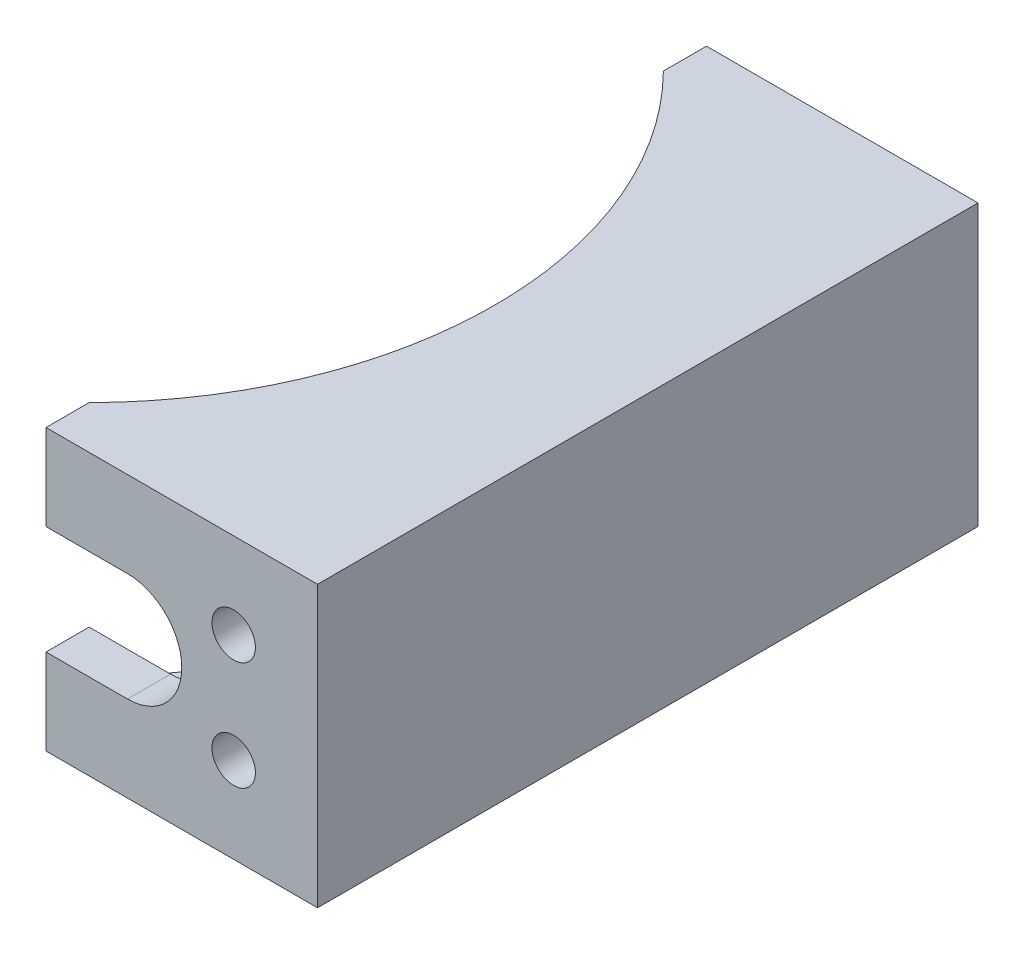
ISO-10303-21;
HEADER;
FILE_DESCRIPTION(('STEP AP214'),'2;1');
FILE_NAME('part.step','',(''),(''),'','','');
FILE_SCHEMA(('AUTOMOTIVE_DESIGN { 1 0 10303 214 1 1 1 1 }'));
ENDSEC;
DATA;
#1=APPLICATION_CONTEXT('core data for automotive mechanical design processes');
#2=APPLICATION_PROTOCOL_DEFINITION('international standard','automotive_design',2000,#1);
#3=PRODUCT_CONTEXT('',#1,'mechanical');
#4=PRODUCT('Part','Part','',(#3));
#5=PRODUCT_RELATED_PRODUCT_CATEGORY('part','',(#4));
#6=PRODUCT_DEFINITION_FORMATION('','',#4);
#7=PRODUCT_DEFINITION_CONTEXT('part definition',#1,'design');
#8=PRODUCT_DEFINITION('design','',#6,#7);
#9=PRODUCT_DEFINITION_SHAPE('','',#8);
#10=(LENGTH_UNIT() NAMED_UNIT(*) SI_UNIT(.MILLI.,.METRE.));
#11=(NAMED_UNIT(*) PLANE_ANGLE_UNIT() SI_UNIT($,.RADIAN.));
#12=(NAMED_UNIT(*) SI_UNIT($,.STERADIAN.) SOLID_ANGLE_UNIT());
#13=UNCERTAINTY_MEASURE_WITH_UNIT(LENGTH_MEASURE(1.E-05),#10,'distance_accuracy_value','');
#14=(GEOMETRIC_REPRESENTATION_CONTEXT(3) GLOBAL_UNCERTAINTY_ASSIGNED_CONTEXT((#13)) GLOBAL_UNIT_ASSIGNED_CONTEXT((#10,
#11,#12)) REPRESENTATION_CONTEXT('',''));
#15=CARTESIAN_POINT('',(0.,0.,0.));
#16=DIRECTION('',(0.,0.,1.));
#17=DIRECTION('',(1.,0.,0.));
#18=AXIS2_PLACEMENT_3D('',#15,#16,#17);
#19=CARTESIAN_POINT('',(-21.276219119007,3.175,21.15));
#20=DIRECTION('',(0.,-1.,0.));
#21=DIRECTION('',(0.,0.,-1.));
#22=AXIS2_PLACEMENT_3D('',#19,#20,#21);
#23=CYLINDRICAL_SURFACE('',#22,30.);
#24=CARTESIAN_POINT('',(-21.276219119007,0.,21.15));
#25=DIRECTION('',(0.,-1.,0.));
#26=DIRECTION('',(0.,0.,1.));
#27=AXIS2_PLACEMENT_3D('',#24,#25,#26);
#28=CIRCLE('',#27,30.);
#29=CARTESIAN_POINT('',(0.,0.,0.));
#30=VERTEX_POINT('',#29);
#31=CARTESIAN_POINT('',(0.,0.,42.3));
#32=VERTEX_POINT('',#31);
#33=EDGE_CURVE('E308',#30,#32,#28,.T.);
#34=ORIENTED_EDGE('',*,*,#33,.T.);
#35=DIRECTION('',(0.,-1.,0.));
#36=VECTOR('',#35,1.);
#37=CARTESIAN_POINT('',(0.,3.175,42.3));
#38=LINE('',#37,#36);
#39=CARTESIAN_POINT('',(0.,3.175,42.3));
#40=VERTEX_POINT('',#39);
#41=EDGE_CURVE('E11',#40,#32,#38,.T.);
#42=ORIENTED_EDGE('',*,*,#41,.F.);
#43=CARTESIAN_POINT('',(-21.276219119007,3.175,21.15));
#44=DIRECTION('',(0.,-1.,0.));
#45=DIRECTION('',(0.,0.,1.));
#46=AXIS2_PLACEMENT_3D('',#43,#44,#45);
#47=CIRCLE('',#46,30.);
#48=CARTESIAN_POINT('',(0.,3.175,0.));
#49=VERTEX_POINT('',#48);
#50=EDGE_CURVE('E309',#49,#40,#47,.T.);
#51=ORIENTED_EDGE('',*,*,#50,.F.);
#52=DIRECTION('',(0.,-1.,0.));
#53=VECTOR('',#52,1.);
#54=CARTESIAN_POINT('',(0.,3.175,0.));
#55=LINE('',#54,#53);
#56=EDGE_CURVE('E40',#49,#30,#55,.T.);
#57=ORIENTED_EDGE('',*,*,#56,.T.);
#58=EDGE_LOOP('',(#34,#42,#51,#57));
#59=FACE_BOUND('',#58,.T.);
#60=ADVANCED_FACE('F33',(#59),#23,.F.);
#61=CARTESIAN_POINT('',(20.,3.175,0.));
#62=DIRECTION('',(-1.,0.,0.));
#63=DIRECTION('',(0.,0.,1.));
#64=AXIS2_PLACEMENT_3D('',#61,#62,#63);
#65=PLANE('',#64);
#66=DIRECTION('',(0.,0.,-1.));
#67=VECTOR('',#66,1.);
#68=CARTESIAN_POINT('',(20.,0.,0.));
#69=LINE('',#68,#67);
#70=CARTESIAN_POINT('',(20.,0.,45.475));
#71=VERTEX_POINT('',#70);
#72=CARTESIAN_POINT('',(20.,0.,-3.175));
#73=VERTEX_POINT('',#72);
#74=EDGE_CURVE('E312',#71,#73,#69,.T.);
#75=ORIENTED_EDGE('',*,*,#74,.T.);
#76=DIRECTION('',(0.,-1.,0.));
#77=VECTOR('',#76,1.);
#78=CARTESIAN_POINT('',(20.,0.,-3.175));
#79=LINE('',#78,#77);
#80=CARTESIAN_POINT('',(20.,20.64,-3.175));
#81=VERTEX_POINT('',#80);
#82=EDGE_CURVE('E164',#81,#73,#79,.T.);
#83=ORIENTED_EDGE('',*,*,#82,.F.);
#84=DIRECTION('',(0.,0.,-1.));
#85=VECTOR('',#84,1.);
#86=CARTESIAN_POINT('',(20.,20.64,0.));
#87=LINE('',#86,#85);
#88=CARTESIAN_POINT('',(20.,20.64,45.475));
#89=VERTEX_POINT('',#88);
#90=EDGE_CURVE('E158',#89,#81,#87,.T.);
#91=ORIENTED_EDGE('',*,*,#90,.F.);
#92=DIRECTION('',(0.,-1.,0.));
#93=VECTOR('',#92,1.);
#94=CARTESIAN_POINT('',(20.,0.,45.475));
#95=LINE('',#94,#93);
#96=EDGE_CURVE('E161',#89,#71,#95,.T.);
#97=ORIENTED_EDGE('',*,*,#96,.T.);
#98=EDGE_LOOP('',(#75,#83,#91,#97));
#99=FACE_BOUND('',#98,.T.);
#100=ADVANCED_FACE('F160',(#99),#65,.F.);
#101=CARTESIAN_POINT('',(-21.276219119007,3.175,21.15));
#102=DIRECTION('',(0.,1.,0.));
#103=DIRECTION('',(0.,0.,1.));
#104=AXIS2_PLACEMENT_3D('',#101,#102,#103);
#105=PLANE('',#104);
#106=DIRECTION('',(0.,0.,1.));
#107=VECTOR('',#106,1.);
#108=CARTESIAN_POINT('',(16.825,3.175,0.));
#109=LINE('',#108,#107);
#110=CARTESIAN_POINT('',(16.825,3.175,0.));
#111=VERTEX_POINT('',#110);
#112=CARTESIAN_POINT('',(16.825,3.175,42.3));
#113=VERTEX_POINT('',#112);
#114=EDGE_CURVE('E47',#111,#113,#109,.T.);
#115=ORIENTED_EDGE('',*,*,#114,.F.);
#116=DIRECTION('',(-1.,0.,0.));
#117=VECTOR('',#116,1.);
#118=CARTESIAN_POINT('',(0.,3.175,0.));
#119=LINE('',#118,#117);
#120=EDGE_CURVE('E53',#111,#49,#119,.T.);
#121=ORIENTED_EDGE('',*,*,#120,.T.);
#122=ORIENTED_EDGE('',*,*,#50,.T.);
#123=DIRECTION('',(1.,0.,0.));
#124=VECTOR('',#123,1.);
#125=CARTESIAN_POINT('',(20.,3.175,42.3));
#126=LINE('',#125,#124);
#127=EDGE_CURVE('E311',#40,#113,#126,.T.);
#128=ORIENTED_EDGE('',*,*,#127,.T.);
#129=EDGE_LOOP('',(#115,#121,#122,#128));
#130=FACE_BOUND('',#129,.T.);
#131=ADVANCED_FACE('F383',(#130),#105,.T.);
#132=CARTESIAN_POINT('',(-21.276219119007,0.,21.15));
#133=DIRECTION('',(0.,1.,0.));
#134=DIRECTION('',(0.,0.,1.));
#135=AXIS2_PLACEMENT_3D('',#132,#133,#134);
#136=PLANE('',#135);
#137=ORIENTED_EDGE('',*,*,#33,.F.);
#138=DIRECTION('',(0.,0.,1.));
#139=VECTOR('',#138,1.);
#140=CARTESIAN_POINT('',(0.,0.,-3.175));
#141=LINE('',#140,#139);
#142=CARTESIAN_POINT('',(0.,0.,-3.175));
#143=VERTEX_POINT('',#142);
#144=EDGE_CURVE('E283',#143,#30,#141,.T.);
#145=ORIENTED_EDGE('',*,*,#144,.F.);
#146=DIRECTION('',(-1.,0.,0.));
#147=VECTOR('',#146,1.);
#148=CARTESIAN_POINT('',(20.,0.,-3.175));
#149=LINE('',#148,#147);
#150=EDGE_CURVE('E244',#73,#143,#149,.T.);
#151=ORIENTED_EDGE('',*,*,#150,.F.);
#152=ORIENTED_EDGE('',*,*,#74,.F.);
#153=DIRECTION('',(-1.,0.,0.));
#154=VECTOR('',#153,1.);
#155=CARTESIAN_POINT('',(20.,0.,45.475));
#156=LINE('',#155,#154);
#157=CARTESIAN_POINT('',(0.,0.,45.475));
#158=VERTEX_POINT('',#157);
#159=EDGE_CURVE('E180',#71,#158,#156,.T.);
#160=ORIENTED_EDGE('',*,*,#159,.T.);
#161=DIRECTION('',(0.,0.,-1.));
#162=VECTOR('',#161,1.);
#163=CARTESIAN_POINT('',(0.,0.,45.475));
#164=LINE('',#163,#162);
#165=EDGE_CURVE('E204',#158,#32,#164,.T.);
#166=ORIENTED_EDGE('',*,*,#165,.T.);
#167=EDGE_LOOP('',(#137,#145,#151,#152,#160,#166));
#168=FACE_BOUND('',#167,.T.);
#169=ADVANCED_FACE('F325',(#168),#136,.F.);
#170=CARTESIAN_POINT('',(16.825,17.465,0.));
#171=DIRECTION('',(1.,0.,0.));
#172=DIRECTION('',(0.,0.,-1.));
#173=AXIS2_PLACEMENT_3D('',#170,#171,#172);
#174=PLANE('',#173);
#175=ORIENTED_EDGE('',*,*,#114,.T.);
#176=DIRECTION('',(0.,-1.,0.));
#177=VECTOR('',#176,1.);
#178=CARTESIAN_POINT('',(16.825,17.465,42.3));
#179=LINE('',#178,#177);
#180=CARTESIAN_POINT('',(16.825,17.465,42.3));
#181=VERTEX_POINT('',#180);
#182=EDGE_CURVE('E303',#181,#113,#179,.T.);
#183=ORIENTED_EDGE('',*,*,#182,.F.);
#184=DIRECTION('',(0.,0.,1.));
#185=VECTOR('',#184,1.);
#186=CARTESIAN_POINT('',(16.825,17.465,0.));
#187=LINE('',#186,#185);
#188=CARTESIAN_POINT('',(16.825,17.465,0.));
#189=VERTEX_POINT('',#188);
#190=EDGE_CURVE('E300',#189,#181,#187,.T.);
#191=ORIENTED_EDGE('',*,*,#190,.F.);
#192=DIRECTION('',(0.,-1.,0.));
#193=VECTOR('',#192,1.);
#194=CARTESIAN_POINT('',(16.825,17.465,0.));
#195=LINE('',#194,#193);
#196=EDGE_CURVE('E306',#189,#111,#195,.T.);
#197=ORIENTED_EDGE('',*,*,#196,.T.);
#198=EDGE_LOOP('',(#175,#183,#191,#197));
#199=FACE_BOUND('',#198,.T.);
#200=ADVANCED_FACE('F357',(#199),#174,.F.);
#201=CARTESIAN_POINT('',(-21.276219119007,17.465,21.15));
#202=DIRECTION('',(0.,1.,0.));
#203=DIRECTION('',(0.,0.,1.));
#204=AXIS2_PLACEMENT_3D('',#201,#202,#203);
#205=CYLINDRICAL_SURFACE('',#204,30.);
#206=CARTESIAN_POINT('',(-21.276219119007,20.64,21.15));
#207=DIRECTION('',(0.,-1.,0.));
#208=DIRECTION('',(0.,0.,1.));
#209=AXIS2_PLACEMENT_3D('',#206,#207,#208);
#210=CIRCLE('',#209,30.);
#211=CARTESIAN_POINT('',(0.,20.64,0.));
#212=VERTEX_POINT('',#211);
#213=CARTESIAN_POINT('',(0.,20.64,42.3));
#214=VERTEX_POINT('',#213);
#215=EDGE_CURVE('E170',#212,#214,#210,.T.);
#216=ORIENTED_EDGE('',*,*,#215,.F.);
#217=DIRECTION('',(0.,1.,0.));
#218=VECTOR('',#217,1.);
#219=CARTESIAN_POINT('',(0.,17.465,0.));
#220=LINE('',#219,#218);
#221=CARTESIAN_POINT('',(0.,17.465,0.));
#222=VERTEX_POINT('',#221);
#223=EDGE_CURVE('E297',#222,#212,#220,.T.);
#224=ORIENTED_EDGE('',*,*,#223,.F.);
#225=CARTESIAN_POINT('',(-21.276219119007,17.465,21.15));
#226=DIRECTION('',(0.,-1.,0.));
#227=DIRECTION('',(0.,0.,1.));
#228=AXIS2_PLACEMENT_3D('',#225,#226,#227);
#229=CIRCLE('',#228,30.);
#230=CARTESIAN_POINT('',(0.,17.465,42.3));
#231=VERTEX_POINT('',#230);
#232=EDGE_CURVE('E169',#222,#231,#229,.T.);
#233=ORIENTED_EDGE('',*,*,#232,.T.);
#234=DIRECTION('',(0.,1.,0.));
#235=VECTOR('',#234,1.);
#236=CARTESIAN_POINT('',(0.,17.465,42.3));
#237=LINE('',#236,#235);
#238=EDGE_CURVE('E293',#231,#214,#237,.T.);
#239=ORIENTED_EDGE('',*,*,#238,.T.);
#240=EDGE_LOOP('',(#216,#224,#233,#239));
#241=FACE_BOUND('',#240,.T.);
#242=ADVANCED_FACE('F342',(#241),#205,.F.);
#243=CARTESIAN_POINT('',(-21.276219119007,17.465,21.15));
#244=DIRECTION('',(0.,-1.,0.));
#245=DIRECTION('',(0.,0.,1.));
#246=AXIS2_PLACEMENT_3D('',#243,#244,#245);
#247=PLANE('',#246);
#248=DIRECTION('',(-1.,0.,0.));
#249=VECTOR('',#248,1.);
#250=CARTESIAN_POINT('',(0.,17.465,0.));
#251=LINE('',#250,#249);
#252=EDGE_CURVE('E288',#189,#222,#251,.T.);
#253=ORIENTED_EDGE('',*,*,#252,.F.);
#254=ORIENTED_EDGE('',*,*,#190,.T.);
#255=DIRECTION('',(1.,0.,0.));
#256=VECTOR('',#255,1.);
#257=CARTESIAN_POINT('',(20.,17.465,42.3));
#258=LINE('',#257,#256);
#259=EDGE_CURVE('E291',#231,#181,#258,.T.);
#260=ORIENTED_EDGE('',*,*,#259,.F.);
#261=ORIENTED_EDGE('',*,*,#232,.F.);
#262=EDGE_LOOP('',(#253,#254,#260,#261));
#263=FACE_BOUND('',#262,.T.);
#264=ADVANCED_FACE('F351',(#263),#247,.T.);
#265=CARTESIAN_POINT('',(-21.276219119007,20.64,21.15));
#266=DIRECTION('',(0.,-1.,0.));
#267=DIRECTION('',(0.,0.,1.));
#268=AXIS2_PLACEMENT_3D('',#265,#266,#267);
#269=PLANE('',#268);
#270=ORIENTED_EDGE('',*,*,#215,.T.);
#271=DIRECTION('',(0.,0.,-1.));
#272=VECTOR('',#271,1.);
#273=CARTESIAN_POINT('',(0.,20.64,45.475));
#274=LINE('',#273,#272);
#275=CARTESIAN_POINT('',(0.,20.64,45.475));
#276=VERTEX_POINT('',#275);
#277=EDGE_CURVE('E185',#276,#214,#274,.T.);
#278=ORIENTED_EDGE('',*,*,#277,.F.);
#279=DIRECTION('',(1.,0.,0.));
#280=VECTOR('',#279,1.);
#281=CARTESIAN_POINT('',(20.,20.64,45.475));
#282=LINE('',#281,#280);
#283=EDGE_CURVE('E176',#276,#89,#282,.T.);
#284=ORIENTED_EDGE('',*,*,#283,.T.);
#285=ORIENTED_EDGE('',*,*,#90,.T.);
#286=DIRECTION('',(1.,0.,0.));
#287=VECTOR('',#286,1.);
#288=CARTESIAN_POINT('',(20.,20.64,-3.175));
#289=LINE('',#288,#287);
#290=CARTESIAN_POINT('',(0.,20.64,-3.175));
#291=VERTEX_POINT('',#290);
#292=EDGE_CURVE('E257',#291,#81,#289,.T.);
#293=ORIENTED_EDGE('',*,*,#292,.F.);
#294=DIRECTION('',(0.,0.,1.));
#295=VECTOR('',#294,1.);
#296=CARTESIAN_POINT('',(0.,20.64,-3.175));
#297=LINE('',#296,#295);
#298=EDGE_CURVE('E259',#291,#212,#297,.T.);
#299=ORIENTED_EDGE('',*,*,#298,.T.);
#300=EDGE_LOOP('',(#270,#278,#284,#285,#293,#299));
#301=FACE_BOUND('',#300,.T.);
#302=ADVANCED_FACE('F184',(#301),#269,.F.);
#303=CARTESIAN_POINT('',(6.,10.32,-3.175));
#304=DIRECTION('',(0.,0.,-1.));
#305=DIRECTION('',(-1.,0.,0.));
#306=AXIS2_PLACEMENT_3D('',#303,#304,#305);
#307=PLANE('',#306);
#308=CARTESIAN_POINT('',(13.825,6.32,-3.175));
#309=DIRECTION('',(0.,0.,-1.));
#310=DIRECTION('',(-1.,0.,0.));
#311=AXIS2_PLACEMENT_3D('',#308,#309,#310);
#312=CIRCLE('',#311,1.6);
#313=CARTESIAN_POINT('',(12.225,6.32,-3.175));
#314=VERTEX_POINT('',#313);
#315=EDGE_CURVE('E237',#314,#314,#312,.T.);
#316=ORIENTED_EDGE('',*,*,#315,.F.);
#317=EDGE_LOOP('',(#316));
#318=FACE_BOUND('',#317,.T.);
#319=ORIENTED_EDGE('',*,*,#82,.T.);
#320=ORIENTED_EDGE('',*,*,#150,.T.);
#321=DIRECTION('',(0.,1.,0.));
#322=VECTOR('',#321,1.);
#323=CARTESIAN_POINT('',(0.,0.,-3.175));
#324=LINE('',#323,#322);
#325=CARTESIAN_POINT('',(0.,6.32,-3.175));
#326=VERTEX_POINT('',#325);
#327=EDGE_CURVE('E247',#143,#326,#324,.T.);
#328=ORIENTED_EDGE('',*,*,#327,.T.);
#329=DIRECTION('',(1.,0.,0.));
#330=VECTOR('',#329,1.);
#331=CARTESIAN_POINT('',(6.,6.32,-3.175));
#332=LINE('',#331,#330);
#333=CARTESIAN_POINT('',(6.,6.32,-3.175));
#334=VERTEX_POINT('',#333);
#335=EDGE_CURVE('E249',#326,#334,#332,.T.);
#336=ORIENTED_EDGE('',*,*,#335,.T.);
#337=CARTESIAN_POINT('',(6.,10.32,-3.175));
#338=DIRECTION('',(0.,0.,1.));
#339=DIRECTION('',(-1.,0.,0.));
#340=AXIS2_PLACEMENT_3D('',#337,#338,#339);
#341=CIRCLE('',#340,4.);
#342=CARTESIAN_POINT('',(6.,14.32,-3.175));
#343=VERTEX_POINT('',#342);
#344=EDGE_CURVE('E251',#334,#343,#341,.T.);
#345=ORIENTED_EDGE('',*,*,#344,.T.);
#346=DIRECTION('',(-1.,0.,0.));
#347=VECTOR('',#346,1.);
#348=CARTESIAN_POINT('',(6.,14.32,-3.175));
#349=LINE('',#348,#347);
#350=CARTESIAN_POINT('',(0.,14.32,-3.175));
#351=VERTEX_POINT('',#350);
#352=EDGE_CURVE('E253',#343,#351,#349,.T.);
#353=ORIENTED_EDGE('',*,*,#352,.T.);
#354=DIRECTION('',(0.,1.,0.));
#355=VECTOR('',#354,1.);
#356=CARTESIAN_POINT('',(0.,14.32,-3.175));
#357=LINE('',#356,#355);
#358=EDGE_CURVE('E255',#351,#291,#357,.T.);
#359=ORIENTED_EDGE('',*,*,#358,.T.);
#360=ORIENTED_EDGE('',*,*,#292,.T.);
#361=EDGE_LOOP('',(#319,#320,#328,#336,#345,#353,#359,#360));
#362=FACE_BOUND('',#361,.T.);
#363=CARTESIAN_POINT('',(13.825,14.32,-3.175));
#364=DIRECTION('',(0.,0.,-1.));
#365=DIRECTION('',(-1.,0.,0.));
#366=AXIS2_PLACEMENT_3D('',#363,#364,#365);
#367=CIRCLE('',#366,1.6);
#368=CARTESIAN_POINT('',(12.225,14.32,-3.175));
#369=VERTEX_POINT('',#368);
#370=EDGE_CURVE('E231',#369,#369,#367,.T.);
#371=ORIENTED_EDGE('',*,*,#370,.F.);
#372=EDGE_LOOP('',(#371));
#373=FACE_BOUND('',#372,.T.);
#374=ADVANCED_FACE('F332',(#318,#362,#373),#307,.T.);
#375=CARTESIAN_POINT('',(6.,10.32,0.));
#376=DIRECTION('',(0.,0.,-1.));
#377=DIRECTION('',(-1.,0.,0.));
#378=AXIS2_PLACEMENT_3D('',#375,#376,#377);
#379=PLANE('',#378);
#380=ORIENTED_EDGE('',*,*,#120,.F.);
#381=ORIENTED_EDGE('',*,*,#196,.F.);
#382=ORIENTED_EDGE('',*,*,#252,.T.);
#383=DIRECTION('',(0.,1.,0.));
#384=VECTOR('',#383,1.);
#385=CARTESIAN_POINT('',(0.,14.32,0.));
#386=LINE('',#385,#384);
#387=CARTESIAN_POINT('',(0.,14.32,0.));
#388=VERTEX_POINT('',#387);
#389=EDGE_CURVE('E245',#388,#222,#386,.T.);
#390=ORIENTED_EDGE('',*,*,#389,.F.);
#391=DIRECTION('',(-1.,0.,0.));
#392=VECTOR('',#391,1.);
#393=CARTESIAN_POINT('',(6.,14.32,0.));
#394=LINE('',#393,#392);
#395=CARTESIAN_POINT('',(6.,14.32,0.));
#396=VERTEX_POINT('',#395);
#397=EDGE_CURVE('E265',#396,#388,#394,.T.);
#398=ORIENTED_EDGE('',*,*,#397,.F.);
#399=CARTESIAN_POINT('',(6.,10.32,0.));
#400=DIRECTION('',(0.,0.,1.));
#401=DIRECTION('',(-1.,0.,0.));
#402=AXIS2_PLACEMENT_3D('',#399,#400,#401);
#403=CIRCLE('',#402,4.);
#404=CARTESIAN_POINT('',(6.,6.32,0.));
#405=VERTEX_POINT('',#404);
#406=EDGE_CURVE('E263',#405,#396,#403,.T.);
#407=ORIENTED_EDGE('',*,*,#406,.F.);
#408=DIRECTION('',(1.,0.,0.));
#409=VECTOR('',#408,1.);
#410=CARTESIAN_POINT('',(6.,6.32,0.));
#411=LINE('',#410,#409);
#412=CARTESIAN_POINT('',(0.,6.32,0.));
#413=VERTEX_POINT('',#412);
#414=EDGE_CURVE('E261',#413,#405,#411,.T.);
#415=ORIENTED_EDGE('',*,*,#414,.F.);
#416=DIRECTION('',(0.,1.,0.));
#417=VECTOR('',#416,1.);
#418=CARTESIAN_POINT('',(0.,0.,0.));
#419=LINE('',#418,#417);
#420=EDGE_CURVE('E240',#49,#413,#419,.T.);
#421=ORIENTED_EDGE('',*,*,#420,.F.);
#422=EDGE_LOOP('',(#380,#381,#382,#390,#398,#407,#415,#421));
#423=FACE_BOUND('',#422,.T.);
#424=CARTESIAN_POINT('',(13.825,6.32,0.));
#425=DIRECTION('',(0.,0.,-1.));
#426=DIRECTION('',(-1.,0.,0.));
#427=AXIS2_PLACEMENT_3D('',#424,#425,#426);
#428=CIRCLE('',#427,1.6);
#429=CARTESIAN_POINT('',(12.225,6.32,0.));
#430=VERTEX_POINT('',#429);
#431=EDGE_CURVE('E234',#430,#430,#428,.T.);
#432=ORIENTED_EDGE('',*,*,#431,.T.);
#433=EDGE_LOOP('',(#432));
#434=FACE_BOUND('',#433,.T.);
#435=CARTESIAN_POINT('',(13.825,14.32,0.));
#436=DIRECTION('',(0.,0.,-1.));
#437=DIRECTION('',(-1.,0.,0.));
#438=AXIS2_PLACEMENT_3D('',#435,#436,#437);
#439=CIRCLE('',#438,1.6);
#440=CARTESIAN_POINT('',(12.225,14.32,0.));
#441=VERTEX_POINT('',#440);
#442=EDGE_CURVE('E230',#441,#441,#439,.T.);
#443=ORIENTED_EDGE('',*,*,#442,.T.);
#444=EDGE_LOOP('',(#443));
#445=FACE_BOUND('',#444,.T.);
#446=ADVANCED_FACE('F347',(#423,#434,#445),#379,.F.);
#447=CARTESIAN_POINT('',(0.,0.,-3.175));
#448=DIRECTION('',(1.,0.,0.));
#449=DIRECTION('',(0.,0.,-1.));
#450=AXIS2_PLACEMENT_3D('',#447,#448,#449);
#451=PLANE('',#450);
#452=ORIENTED_EDGE('',*,*,#56,.F.);
#453=ORIENTED_EDGE('',*,*,#420,.T.);
#454=DIRECTION('',(0.,0.,1.));
#455=VECTOR('',#454,1.);
#456=CARTESIAN_POINT('',(0.,6.32,-3.175));
#457=LINE('',#456,#455);
#458=EDGE_CURVE('E280',#326,#413,#457,.T.);
#459=ORIENTED_EDGE('',*,*,#458,.F.);
#460=ORIENTED_EDGE('',*,*,#327,.F.);
#461=ORIENTED_EDGE('',*,*,#144,.T.);
#462=EDGE_LOOP('',(#452,#453,#459,#460,#461));
#463=FACE_BOUND('',#462,.T.);
#464=ADVANCED_FACE('F328',(#463),#451,.F.);
#465=CARTESIAN_POINT('',(6.,6.32,-3.175));
#466=DIRECTION('',(0.,-1.,0.));
#467=DIRECTION('',(0.,0.,-1.));
#468=AXIS2_PLACEMENT_3D('',#465,#466,#467);
#469=PLANE('',#468);
#470=ORIENTED_EDGE('',*,*,#414,.T.);
#471=DIRECTION('',(0.,0.,1.));
#472=VECTOR('',#471,1.);
#473=CARTESIAN_POINT('',(6.,6.32,-3.175));
#474=LINE('',#473,#472);
#475=EDGE_CURVE('E277',#334,#405,#474,.T.);
#476=ORIENTED_EDGE('',*,*,#475,.F.);
#477=ORIENTED_EDGE('',*,*,#335,.F.);
#478=ORIENTED_EDGE('',*,*,#458,.T.);
#479=EDGE_LOOP('',(#470,#476,#477,#478));
#480=FACE_BOUND('',#479,.T.);
#481=ADVANCED_FACE('F361',(#480),#469,.F.);
#482=CARTESIAN_POINT('',(6.,10.32,-3.175));
#483=DIRECTION('',(0.,0.,1.));
#484=DIRECTION('',(1.,0.,0.));
#485=AXIS2_PLACEMENT_3D('',#482,#483,#484);
#486=CYLINDRICAL_SURFACE('',#485,4.);
#487=ORIENTED_EDGE('',*,*,#406,.T.);
#488=DIRECTION('',(0.,0.,1.));
#489=VECTOR('',#488,1.);
#490=CARTESIAN_POINT('',(6.,14.32,-3.175));
#491=LINE('',#490,#489);
#492=EDGE_CURVE('E274',#343,#396,#491,.T.);
#493=ORIENTED_EDGE('',*,*,#492,.F.);
#494=ORIENTED_EDGE('',*,*,#344,.F.);
#495=ORIENTED_EDGE('',*,*,#475,.T.);
#496=EDGE_LOOP('',(#487,#493,#494,#495));
#497=FACE_BOUND('',#496,.T.);
#498=ADVANCED_FACE('F365',(#497),#486,.F.);
#499=CARTESIAN_POINT('',(6.,14.32,-3.175));
#500=DIRECTION('',(0.,1.,0.));
#501=DIRECTION('',(0.,0.,1.));
#502=AXIS2_PLACEMENT_3D('',#499,#500,#501);
#503=PLANE('',#502);
#504=ORIENTED_EDGE('',*,*,#397,.T.);
#505=DIRECTION('',(0.,0.,1.));
#506=VECTOR('',#505,1.);
#507=CARTESIAN_POINT('',(0.,14.32,-3.175));
#508=LINE('',#507,#506);
#509=EDGE_CURVE('E271',#351,#388,#508,.T.);
#510=ORIENTED_EDGE('',*,*,#509,.F.);
#511=ORIENTED_EDGE('',*,*,#352,.F.);
#512=ORIENTED_EDGE('',*,*,#492,.T.);
#513=EDGE_LOOP('',(#504,#510,#511,#512));
#514=FACE_BOUND('',#513,.T.);
#515=ADVANCED_FACE('F369',(#514),#503,.F.);
#516=CARTESIAN_POINT('',(0.,14.32,-3.175));
#517=DIRECTION('',(1.,0.,0.));
#518=DIRECTION('',(0.,0.,-1.));
#519=AXIS2_PLACEMENT_3D('',#516,#517,#518);
#520=PLANE('',#519);
#521=ORIENTED_EDGE('',*,*,#389,.T.);
#522=ORIENTED_EDGE('',*,*,#223,.T.);
#523=ORIENTED_EDGE('',*,*,#298,.F.);
#524=ORIENTED_EDGE('',*,*,#358,.F.);
#525=ORIENTED_EDGE('',*,*,#509,.T.);
#526=EDGE_LOOP('',(#521,#522,#523,#524,#525));
#527=FACE_BOUND('',#526,.T.);
#528=ADVANCED_FACE('F338',(#527),#520,.F.);
#529=CARTESIAN_POINT('',(13.825,6.32,-3.175));
#530=DIRECTION('',(0.,0.,1.));
#531=DIRECTION('',(1.,0.,0.));
#532=AXIS2_PLACEMENT_3D('',#529,#530,#531);
#533=CYLINDRICAL_SURFACE('',#532,1.6);
#534=ORIENTED_EDGE('',*,*,#315,.T.);
#535=EDGE_LOOP('',(#534));
#536=FACE_BOUND('',#535,.T.);
#537=ORIENTED_EDGE('',*,*,#431,.F.);
#538=EDGE_LOOP('',(#537));
#539=FACE_BOUND('',#538,.T.);
#540=ADVANCED_FACE('F376',(#536,#539),#533,.F.);
#541=CARTESIAN_POINT('',(13.825,14.32,-3.175));
#542=DIRECTION('',(0.,0.,1.));
#543=DIRECTION('',(1.,0.,0.));
#544=AXIS2_PLACEMENT_3D('',#541,#542,#543);
#545=CYLINDRICAL_SURFACE('',#544,1.6);
#546=ORIENTED_EDGE('',*,*,#370,.T.);
#547=EDGE_LOOP('',(#546));
#548=FACE_BOUND('',#547,.T.);
#549=ORIENTED_EDGE('',*,*,#442,.F.);
#550=EDGE_LOOP('',(#549));
#551=FACE_BOUND('',#550,.T.);
#552=ADVANCED_FACE('F430',(#548,#551),#545,.F.);
#553=CARTESIAN_POINT('',(6.,10.32,42.3));
#554=DIRECTION('',(0.,0.,1.));
#555=DIRECTION('',(-1.,0.,0.));
#556=AXIS2_PLACEMENT_3D('',#553,#554,#555);
#557=PLANE('',#556);
#558=CARTESIAN_POINT('',(13.825,14.32,42.3));
#559=DIRECTION('',(0.,0.,-1.));
#560=DIRECTION('',(-1.,0.,0.));
#561=AXIS2_PLACEMENT_3D('',#558,#559,#560);
#562=CIRCLE('',#561,1.6);
#563=CARTESIAN_POINT('',(12.225,14.32,42.3));
#564=VERTEX_POINT('',#563);
#565=EDGE_CURVE('E634',#564,#564,#562,.T.);
#566=ORIENTED_EDGE('',*,*,#565,.F.);
#567=EDGE_LOOP('',(#566));
#568=FACE_BOUND('',#567,.T.);
#569=CARTESIAN_POINT('',(13.825,6.32,42.3));
#570=DIRECTION('',(0.,0.,-1.));
#571=DIRECTION('',(-1.,0.,0.));
#572=AXIS2_PLACEMENT_3D('',#569,#570,#571);
#573=CIRCLE('',#572,1.6);
#574=CARTESIAN_POINT('',(12.225,6.32,42.3));
#575=VERTEX_POINT('',#574);
#576=EDGE_CURVE('E636',#575,#575,#573,.T.);
#577=ORIENTED_EDGE('',*,*,#576,.F.);
#578=EDGE_LOOP('',(#577));
#579=FACE_BOUND('',#578,.T.);
#580=DIRECTION('',(0.,1.,0.));
#581=VECTOR('',#580,1.);
#582=CARTESIAN_POINT('',(0.,14.32,42.3));
#583=LINE('',#582,#581);
#584=CARTESIAN_POINT('',(0.,14.32,42.3));
#585=VERTEX_POINT('',#584);
#586=EDGE_CURVE('E205',#585,#231,#583,.T.);
#587=ORIENTED_EDGE('',*,*,#586,.T.);
#588=ORIENTED_EDGE('',*,*,#259,.T.);
#589=ORIENTED_EDGE('',*,*,#182,.T.);
#590=ORIENTED_EDGE('',*,*,#127,.F.);
#591=DIRECTION('',(0.,1.,0.));
#592=VECTOR('',#591,1.);
#593=CARTESIAN_POINT('',(0.,0.,42.3));
#594=LINE('',#593,#592);
#595=CARTESIAN_POINT('',(0.,6.32,42.3));
#596=VERTEX_POINT('',#595);
#597=EDGE_CURVE('E181',#40,#596,#594,.T.);
#598=ORIENTED_EDGE('',*,*,#597,.T.);
#599=DIRECTION('',(1.,0.,0.));
#600=VECTOR('',#599,1.);
#601=CARTESIAN_POINT('',(6.,6.32,42.3));
#602=LINE('',#601,#600);
#603=CARTESIAN_POINT('',(6.,6.32,42.3));
#604=VERTEX_POINT('',#603);
#605=EDGE_CURVE('E215',#596,#604,#602,.T.);
#606=ORIENTED_EDGE('',*,*,#605,.T.);
#607=CARTESIAN_POINT('',(6.,10.32,42.3));
#608=DIRECTION('',(0.,0.,1.));
#609=DIRECTION('',(-1.,0.,0.));
#610=AXIS2_PLACEMENT_3D('',#607,#608,#609);
#611=CIRCLE('',#610,4.);
#612=CARTESIAN_POINT('',(6.,14.32,42.3));
#613=VERTEX_POINT('',#612);
#614=EDGE_CURVE('E212',#604,#613,#611,.T.);
#615=ORIENTED_EDGE('',*,*,#614,.T.);
#616=DIRECTION('',(-1.,0.,0.));
#617=VECTOR('',#616,1.);
#618=CARTESIAN_POINT('',(6.,14.32,42.3));
#619=LINE('',#618,#617);
#620=EDGE_CURVE('E208',#613,#585,#619,.T.);
#621=ORIENTED_EDGE('',*,*,#620,.T.);
#622=EDGE_LOOP('',(#587,#588,#589,#590,#598,#606,#615,#621));
#623=FACE_BOUND('',#622,.T.);
#624=ADVANCED_FACE('F354',(#568,#579,#623),#557,.F.);
#625=CARTESIAN_POINT('',(0.,14.32,45.475));
#626=DIRECTION('',(-1.,0.,0.));
#627=DIRECTION('',(0.,0.,1.));
#628=AXIS2_PLACEMENT_3D('',#625,#626,#627);
#629=PLANE('',#628);
#630=ORIENTED_EDGE('',*,*,#586,.F.);
#631=DIRECTION('',(0.,0.,-1.));
#632=VECTOR('',#631,1.);
#633=CARTESIAN_POINT('',(0.,14.32,45.475));
#634=LINE('',#633,#632);
#635=CARTESIAN_POINT('',(0.,14.32,45.475));
#636=VERTEX_POINT('',#635);
#637=EDGE_CURVE('E227',#636,#585,#634,.T.);
#638=ORIENTED_EDGE('',*,*,#637,.F.);
#639=DIRECTION('',(0.,1.,0.));
#640=VECTOR('',#639,1.);
#641=CARTESIAN_POINT('',(0.,14.32,45.475));
#642=LINE('',#641,#640);
#643=EDGE_CURVE('E186',#636,#276,#642,.T.);
#644=ORIENTED_EDGE('',*,*,#643,.T.);
#645=ORIENTED_EDGE('',*,*,#277,.T.);
#646=ORIENTED_EDGE('',*,*,#238,.F.);
#647=EDGE_LOOP('',(#630,#638,#644,#645,#646));
#648=FACE_BOUND('',#647,.T.);
#649=ADVANCED_FACE('F502',(#648),#629,.T.);
#650=CARTESIAN_POINT('',(6.,14.32,45.475));
#651=DIRECTION('',(0.,-1.,0.));
#652=DIRECTION('',(0.,0.,-1.));
#653=AXIS2_PLACEMENT_3D('',#650,#651,#652);
#654=PLANE('',#653);
#655=ORIENTED_EDGE('',*,*,#620,.F.);
#656=DIRECTION('',(0.,0.,-1.));
#657=VECTOR('',#656,1.);
#658=CARTESIAN_POINT('',(6.,14.32,45.475));
#659=LINE('',#658,#657);
#660=CARTESIAN_POINT('',(6.,14.32,45.475));
#661=VERTEX_POINT('',#660);
#662=EDGE_CURVE('E225',#661,#613,#659,.T.);
#663=ORIENTED_EDGE('',*,*,#662,.F.);
#664=DIRECTION('',(-1.,0.,0.));
#665=VECTOR('',#664,1.);
#666=CARTESIAN_POINT('',(6.,14.32,45.475));
#667=LINE('',#666,#665);
#668=EDGE_CURVE('E188',#661,#636,#667,.T.);
#669=ORIENTED_EDGE('',*,*,#668,.T.);
#670=ORIENTED_EDGE('',*,*,#637,.T.);
#671=EDGE_LOOP('',(#655,#663,#669,#670));
#672=FACE_BOUND('',#671,.T.);
#673=ADVANCED_FACE('F512',(#672),#654,.T.);
#674=CARTESIAN_POINT('',(6.,10.32,45.475));
#675=DIRECTION('',(0.,0.,-1.));
#676=DIRECTION('',(-1.,0.,0.));
#677=AXIS2_PLACEMENT_3D('',#674,#675,#676);
#678=CYLINDRICAL_SURFACE('',#677,4.);
#679=ORIENTED_EDGE('',*,*,#614,.F.);
#680=DIRECTION('',(0.,0.,-1.));
#681=VECTOR('',#680,1.);
#682=CARTESIAN_POINT('',(6.,6.32,45.475));
#683=LINE('',#682,#681);
#684=CARTESIAN_POINT('',(6.,6.32,45.475));
#685=VERTEX_POINT('',#684);
#686=EDGE_CURVE('E223',#685,#604,#683,.T.);
#687=ORIENTED_EDGE('',*,*,#686,.F.);
#688=CARTESIAN_POINT('',(6.,10.32,45.475));
#689=DIRECTION('',(0.,0.,1.));
#690=DIRECTION('',(-1.,0.,0.));
#691=AXIS2_PLACEMENT_3D('',#688,#689,#690);
#692=CIRCLE('',#691,4.);
#693=EDGE_CURVE('E194',#685,#661,#692,.T.);
#694=ORIENTED_EDGE('',*,*,#693,.T.);
#695=ORIENTED_EDGE('',*,*,#662,.T.);
#696=EDGE_LOOP('',(#679,#687,#694,#695));
#697=FACE_BOUND('',#696,.T.);
#698=ADVANCED_FACE('F522',(#697),#678,.F.);
#699=CARTESIAN_POINT('',(6.,6.32,45.475));
#700=DIRECTION('',(0.,1.,0.));
#701=DIRECTION('',(0.,0.,1.));
#702=AXIS2_PLACEMENT_3D('',#699,#700,#701);
#703=PLANE('',#702);
#704=ORIENTED_EDGE('',*,*,#605,.F.);
#705=DIRECTION('',(0.,0.,-1.));
#706=VECTOR('',#705,1.);
#707=CARTESIAN_POINT('',(0.,6.32,45.475));
#708=LINE('',#707,#706);
#709=CARTESIAN_POINT('',(0.,6.32,45.475));
#710=VERTEX_POINT('',#709);
#711=EDGE_CURVE('E220',#710,#596,#708,.T.);
#712=ORIENTED_EDGE('',*,*,#711,.F.);
#713=DIRECTION('',(1.,0.,0.));
#714=VECTOR('',#713,1.);
#715=CARTESIAN_POINT('',(6.,6.32,45.475));
#716=LINE('',#715,#714);
#717=EDGE_CURVE('E197',#710,#685,#716,.T.);
#718=ORIENTED_EDGE('',*,*,#717,.T.);
#719=ORIENTED_EDGE('',*,*,#686,.T.);
#720=EDGE_LOOP('',(#704,#712,#718,#719));
#721=FACE_BOUND('',#720,.T.);
#722=ADVANCED_FACE('F532',(#721),#703,.T.);
#723=CARTESIAN_POINT('',(0.,0.,45.475));
#724=DIRECTION('',(-1.,0.,0.));
#725=DIRECTION('',(0.,0.,1.));
#726=AXIS2_PLACEMENT_3D('',#723,#724,#725);
#727=PLANE('',#726);
#728=ORIENTED_EDGE('',*,*,#41,.T.);
#729=ORIENTED_EDGE('',*,*,#165,.F.);
#730=DIRECTION('',(0.,1.,0.));
#731=VECTOR('',#730,1.);
#732=CARTESIAN_POINT('',(0.,0.,45.475));
#733=LINE('',#732,#731);
#734=EDGE_CURVE('E200',#158,#710,#733,.T.);
#735=ORIENTED_EDGE('',*,*,#734,.T.);
#736=ORIENTED_EDGE('',*,*,#711,.T.);
#737=ORIENTED_EDGE('',*,*,#597,.F.);
#738=EDGE_LOOP('',(#728,#729,#735,#736,#737));
#739=FACE_BOUND('',#738,.T.);
#740=ADVANCED_FACE('F542',(#739),#727,.T.);
#741=CARTESIAN_POINT('',(6.,10.32,45.475));
#742=DIRECTION('',(0.,0.,1.));
#743=DIRECTION('',(-1.,0.,0.));
#744=AXIS2_PLACEMENT_3D('',#741,#742,#743);
#745=PLANE('',#744);
#746=CARTESIAN_POINT('',(13.825,14.32,45.475));
#747=DIRECTION('',(0.,0.,-1.));
#748=DIRECTION('',(-1.,0.,0.));
#749=AXIS2_PLACEMENT_3D('',#746,#747,#748);
#750=CIRCLE('',#749,1.6);
#751=CARTESIAN_POINT('',(12.225,14.32,45.475));
#752=VERTEX_POINT('',#751);
#753=EDGE_CURVE('E631',#752,#752,#750,.T.);
#754=ORIENTED_EDGE('',*,*,#753,.T.);
#755=EDGE_LOOP('',(#754));
#756=FACE_BOUND('',#755,.T.);
#757=CARTESIAN_POINT('',(13.825,6.32,45.475));
#758=DIRECTION('',(0.,0.,-1.));
#759=DIRECTION('',(-1.,0.,0.));
#760=AXIS2_PLACEMENT_3D('',#757,#758,#759);
#761=CIRCLE('',#760,1.6);
#762=CARTESIAN_POINT('',(12.225,6.32,45.475));
#763=VERTEX_POINT('',#762);
#764=EDGE_CURVE('E209',#763,#763,#761,.T.);
#765=ORIENTED_EDGE('',*,*,#764,.T.);
#766=EDGE_LOOP('',(#765));
#767=FACE_BOUND('',#766,.T.);
#768=ORIENTED_EDGE('',*,*,#96,.F.);
#769=ORIENTED_EDGE('',*,*,#283,.F.);
#770=ORIENTED_EDGE('',*,*,#643,.F.);
#771=ORIENTED_EDGE('',*,*,#668,.F.);
#772=ORIENTED_EDGE('',*,*,#693,.F.);
#773=ORIENTED_EDGE('',*,*,#717,.F.);
#774=ORIENTED_EDGE('',*,*,#734,.F.);
#775=ORIENTED_EDGE('',*,*,#159,.F.);
#776=EDGE_LOOP('',(#768,#769,#770,#771,#772,#773,#774,#775));
#777=FACE_BOUND('',#776,.T.);
#778=ADVANCED_FACE('F174',(#756,#767,#777),#745,.T.);
#779=CARTESIAN_POINT('',(13.825,6.32,45.475));
#780=DIRECTION('',(0.,0.,-1.));
#781=DIRECTION('',(-1.,0.,0.));
#782=AXIS2_PLACEMENT_3D('',#779,#780,#781);
#783=CYLINDRICAL_SURFACE('',#782,1.6);
#784=ORIENTED_EDGE('',*,*,#764,.F.);
#785=EDGE_LOOP('',(#784));
#786=FACE_BOUND('',#785,.T.);
#787=ORIENTED_EDGE('',*,*,#576,.T.);
#788=EDGE_LOOP('',(#787));
#789=FACE_BOUND('',#788,.T.);
#790=ADVANCED_FACE('F561',(#786,#789),#783,.F.);
#791=CARTESIAN_POINT('',(13.825,14.32,45.475));
#792=DIRECTION('',(0.,0.,-1.));
#793=DIRECTION('',(-1.,0.,0.));
#794=AXIS2_PLACEMENT_3D('',#791,#792,#793);
#795=CYLINDRICAL_SURFACE('',#794,1.6);
#796=ORIENTED_EDGE('',*,*,#753,.F.);
#797=EDGE_LOOP('',(#796));
#798=FACE_BOUND('',#797,.T.);
#799=ORIENTED_EDGE('',*,*,#565,.T.);
#800=EDGE_LOOP('',(#799));
#801=FACE_BOUND('',#800,.T.);
#802=ADVANCED_FACE('F571',(#798,#801),#795,.F.);
#803=CLOSED_SHELL('',(#60,#100,#131,#169,#200,#242,#264,#302,#374,#446,#464,#481,#498,#515,#528,
#540,#552,#624,#649,#673,#698,#722,#740,#778,#790,#802));
#804=MANIFOLD_SOLID_BREP('B2',#803);
#805=ADVANCED_BREP_SHAPE_REPRESENTATION('',(#18,#804),#14);
#806=SHAPE_DEFINITION_REPRESENTATION(#9,#805);
ENDSEC;
END-ISO-10303-21;
